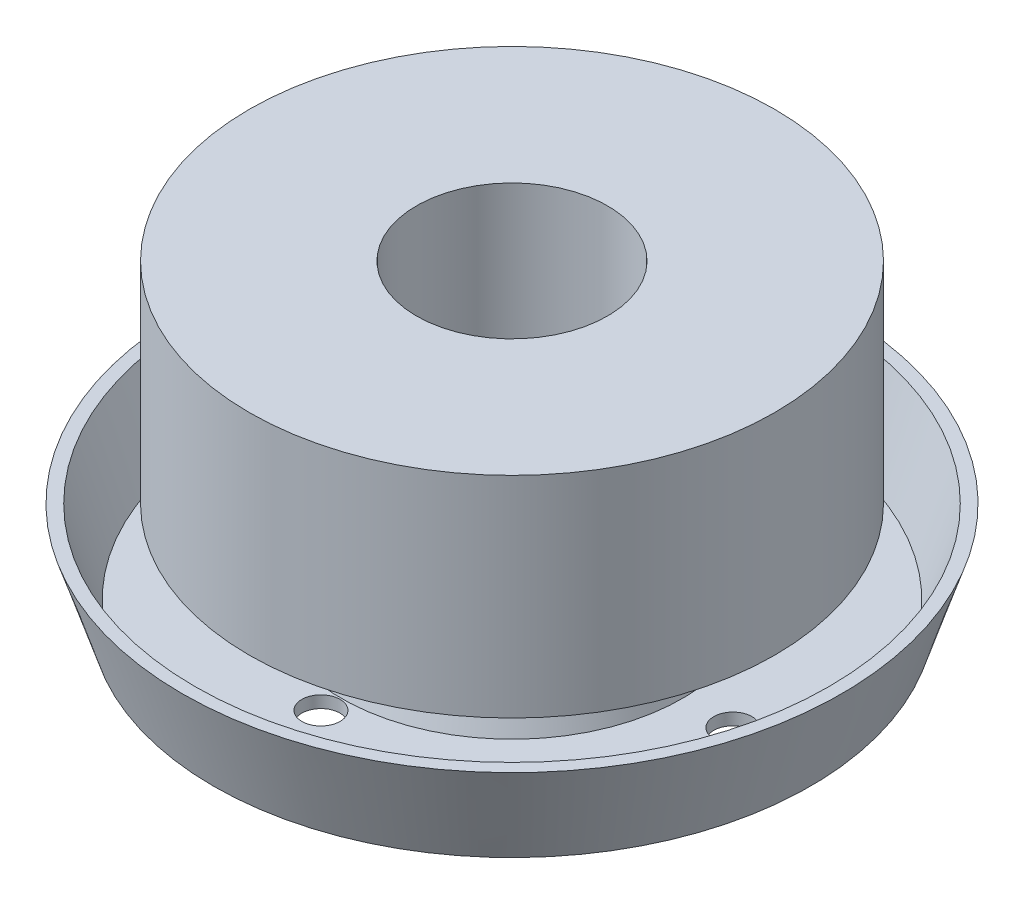
ISO-10303-21;
HEADER;
FILE_DESCRIPTION(('STEP AP214'),'2;1');
FILE_NAME('part.step','',(''),(''),'','','');
FILE_SCHEMA(('AUTOMOTIVE_DESIGN { 1 0 10303 214 1 1 1 1 }'));
ENDSEC;
DATA;
#1=APPLICATION_CONTEXT('core data for automotive mechanical design processes');
#2=APPLICATION_PROTOCOL_DEFINITION('international standard','automotive_design',2000,#1);
#3=PRODUCT_CONTEXT('',#1,'mechanical');
#4=PRODUCT('Part','Part','',(#3));
#5=PRODUCT_RELATED_PRODUCT_CATEGORY('part','',(#4));
#6=PRODUCT_DEFINITION_FORMATION('','',#4);
#7=PRODUCT_DEFINITION_CONTEXT('part definition',#1,'design');
#8=PRODUCT_DEFINITION('design','',#6,#7);
#9=PRODUCT_DEFINITION_SHAPE('','',#8);
#10=(LENGTH_UNIT() NAMED_UNIT(*) SI_UNIT(.MILLI.,.METRE.));
#11=(NAMED_UNIT(*) PLANE_ANGLE_UNIT() SI_UNIT($,.RADIAN.));
#12=(NAMED_UNIT(*) SI_UNIT($,.STERADIAN.) SOLID_ANGLE_UNIT());
#13=UNCERTAINTY_MEASURE_WITH_UNIT(LENGTH_MEASURE(1.E-05),#10,'distance_accuracy_value','');
#14=(GEOMETRIC_REPRESENTATION_CONTEXT(3) GLOBAL_UNCERTAINTY_ASSIGNED_CONTEXT((#13)) GLOBAL_UNIT_ASSIGNED_CONTEXT((#10,
#11,#12)) REPRESENTATION_CONTEXT('',''));
#15=CARTESIAN_POINT('',(0.,0.,0.));
#16=DIRECTION('',(0.,0.,1.));
#17=DIRECTION('',(1.,0.,0.));
#18=AXIS2_PLACEMENT_3D('',#15,#16,#17);
#19=CARTESIAN_POINT('',(1.5,4.,0.));
#20=DIRECTION('',(0.,1.,0.));
#21=DIRECTION('',(0.,0.,1.));
#22=AXIS2_PLACEMENT_3D('',#19,#20,#21);
#23=PLANE('',#22);
#24=CARTESIAN_POINT('',(0.,4.,0.));
#25=DIRECTION('',(0.,1.,0.));
#26=DIRECTION('',(0.,0.,1.));
#27=AXIS2_PLACEMENT_3D('',#24,#25,#26);
#28=CIRCLE('',#27,4.);
#29=CARTESIAN_POINT('',(0.,4.,4.));
#30=VERTEX_POINT('',#29);
#31=EDGE_CURVE('E11',#30,#30,#28,.F.);
#32=ORIENTED_EDGE('',*,*,#31,.F.);
#33=EDGE_LOOP('',(#32));
#34=FACE_BOUND('',#33,.T.);
#35=CARTESIAN_POINT('',(0.,4.,0.));
#36=DIRECTION('',(0.,-1.,0.));
#37=DIRECTION('',(0.,0.,-1.));
#38=AXIS2_PLACEMENT_3D('',#35,#36,#37);
#39=CIRCLE('',#38,1.5);
#40=CARTESIAN_POINT('',(0.,4.,-1.5));
#41=VERTEX_POINT('',#40);
#42=EDGE_CURVE('E138',#41,#41,#39,.T.);
#43=ORIENTED_EDGE('',*,*,#42,.T.);
#44=EDGE_LOOP('',(#43));
#45=FACE_BOUND('',#44,.T.);
#46=ADVANCED_FACE('F33',(#34,#45),#23,.T.);
#47=CARTESIAN_POINT('',(0.,0.5,0.));
#48=DIRECTION('',(0.,-1.,0.));
#49=DIRECTION('',(0.,0.,-1.));
#50=AXIS2_PLACEMENT_3D('',#47,#48,#49);
#51=CONICAL_SURFACE('',#50,7.1375,0.314231899084339);
#52=CARTESIAN_POINT('',(0.,4.,0.));
#53=DIRECTION('',(0.,1.,0.));
#54=DIRECTION('',(0.,0.,1.));
#55=AXIS2_PLACEMENT_3D('',#52,#53,#54);
#56=CIRCLE('',#55,6.);
#57=CARTESIAN_POINT('',(0.,4.,6.));
#58=VERTEX_POINT('',#57);
#59=EDGE_CURVE('E141',#58,#58,#56,.F.);
#60=ORIENTED_EDGE('',*,*,#59,.T.);
#61=EDGE_LOOP('',(#60));
#62=FACE_BOUND('',#61,.T.);
#63=CARTESIAN_POINT('',(0.,0.5,0.));
#64=DIRECTION('',(0.,-1.,0.));
#65=DIRECTION('',(0.,0.,-1.));
#66=AXIS2_PLACEMENT_3D('',#63,#64,#65);
#67=CIRCLE('',#66,7.1375);
#68=CARTESIAN_POINT('',(0.,0.5,-7.1375));
#69=VERTEX_POINT('',#68);
#70=EDGE_CURVE('E40',#69,#69,#67,.T.);
#71=ORIENTED_EDGE('',*,*,#70,.F.);
#72=EDGE_LOOP('',(#71));
#73=FACE_BOUND('',#72,.T.);
#74=ADVANCED_FACE('F127',(#62,#73),#51,.T.);
#75=CARTESIAN_POINT('',(7.1375,0.500000000000001,0.));
#76=DIRECTION('',(0.,1.,0.));
#77=DIRECTION('',(0.,0.,1.));
#78=AXIS2_PLACEMENT_3D('',#75,#76,#77);
#79=PLANE('',#78);
#80=CARTESIAN_POINT('',(0.,0.500000000000001,-8.));
#81=DIRECTION('',(0.,1.,0.));
#82=DIRECTION('',(0.,0.,1.));
#83=AXIS2_PLACEMENT_3D('',#80,#81,#82);
#84=CIRCLE('',#83,0.8);
#85=CARTESIAN_POINT('',(0.,0.500000000000001,-7.2));
#86=VERTEX_POINT('',#85);
#87=EDGE_CURVE('E245',#86,#86,#84,.T.);
#88=ORIENTED_EDGE('',*,*,#87,.F.);
#89=EDGE_LOOP('',(#88));
#90=FACE_BOUND('',#89,.T.);
#91=CARTESIAN_POINT('',(0.,0.500000000000001,8.));
#92=DIRECTION('',(0.,1.,0.));
#93=DIRECTION('',(0.,0.,1.));
#94=AXIS2_PLACEMENT_3D('',#91,#92,#93);
#95=CIRCLE('',#94,0.8);
#96=CARTESIAN_POINT('',(0.,0.500000000000001,8.8));
#97=VERTEX_POINT('',#96);
#98=EDGE_CURVE('E256',#97,#97,#95,.T.);
#99=ORIENTED_EDGE('',*,*,#98,.F.);
#100=EDGE_LOOP('',(#99));
#101=FACE_BOUND('',#100,.T.);
#102=CARTESIAN_POINT('',(9.25,0.500000000000001,0.));
#103=DIRECTION('',(0.,1.,0.));
#104=DIRECTION('',(0.,0.,1.));
#105=AXIS2_PLACEMENT_3D('',#102,#103,#104);
#106=CIRCLE('',#105,0.8);
#107=CARTESIAN_POINT('',(9.25,0.500000000000001,0.8));
#108=VERTEX_POINT('',#107);
#109=EDGE_CURVE('E262',#108,#108,#106,.T.);
#110=ORIENTED_EDGE('',*,*,#109,.F.);
#111=EDGE_LOOP('',(#110));
#112=FACE_BOUND('',#111,.T.);
#113=CARTESIAN_POINT('',(-9.25,0.500000000000001,0.));
#114=DIRECTION('',(0.,1.,0.));
#115=DIRECTION('',(0.,0.,1.));
#116=AXIS2_PLACEMENT_3D('',#113,#114,#115);
#117=CIRCLE('',#116,0.8);
#118=CARTESIAN_POINT('',(-9.25,0.500000000000001,0.8));
#119=VERTEX_POINT('',#118);
#120=EDGE_CURVE('E268',#119,#119,#117,.T.);
#121=ORIENTED_EDGE('',*,*,#120,.F.);
#122=EDGE_LOOP('',(#121));
#123=FACE_BOUND('',#122,.T.);
#124=ORIENTED_EDGE('',*,*,#70,.T.);
#125=EDGE_LOOP('',(#124));
#126=FACE_BOUND('',#125,.T.);
#127=CARTESIAN_POINT('',(0.,0.500000000000002,0.));
#128=DIRECTION('',(0.,-1.,0.));
#129=DIRECTION('',(0.,0.,-1.));
#130=AXIS2_PLACEMENT_3D('',#127,#128,#129);
#131=CIRCLE('',#130,12.1367564788797);
#132=CARTESIAN_POINT('',(0.,0.500000000000002,-12.1367564788797));
#133=VERTEX_POINT('',#132);
#134=EDGE_CURVE('E159',#133,#133,#131,.T.);
#135=ORIENTED_EDGE('',*,*,#134,.F.);
#136=EDGE_LOOP('',(#135));
#137=FACE_BOUND('',#136,.T.);
#138=ADVANCED_FACE('F132',(#90,#101,#112,#123,#126,#137),#79,.T.);
#139=CARTESIAN_POINT('',(0.,4.,0.));
#140=DIRECTION('',(0.,1.,0.));
#141=DIRECTION('',(0.,0.,1.));
#142=AXIS2_PLACEMENT_3D('',#139,#140,#141);
#143=CONICAL_SURFACE('',#142,13.2742564788797,0.314231899084338);
#144=ORIENTED_EDGE('',*,*,#134,.T.);
#145=EDGE_LOOP('',(#144));
#146=FACE_BOUND('',#145,.T.);
#147=CARTESIAN_POINT('',(0.,4.,0.));
#148=DIRECTION('',(0.,-1.,0.));
#149=DIRECTION('',(0.,0.,-1.));
#150=AXIS2_PLACEMENT_3D('',#147,#148,#149);
#151=CIRCLE('',#150,13.2742564788797);
#152=CARTESIAN_POINT('',(0.,4.,-13.2742564788797));
#153=VERTEX_POINT('',#152);
#154=EDGE_CURVE('E156',#153,#153,#151,.T.);
#155=ORIENTED_EDGE('',*,*,#154,.F.);
#156=EDGE_LOOP('',(#155));
#157=FACE_BOUND('',#156,.T.);
#158=ADVANCED_FACE('F167',(#146,#157),#143,.F.);
#159=CARTESIAN_POINT('',(13.2742564788797,4.,0.));
#160=DIRECTION('',(0.,1.,0.));
#161=DIRECTION('',(0.,0.,1.));
#162=AXIS2_PLACEMENT_3D('',#159,#160,#161);
#163=PLANE('',#162);
#164=ORIENTED_EDGE('',*,*,#154,.T.);
#165=EDGE_LOOP('',(#164));
#166=FACE_BOUND('',#165,.T.);
#167=CARTESIAN_POINT('',(0.,4.,0.));
#168=DIRECTION('',(0.,-1.,0.));
#169=DIRECTION('',(0.,0.,-1.));
#170=AXIS2_PLACEMENT_3D('',#167,#168,#169);
#171=CIRCLE('',#170,13.8);
#172=CARTESIAN_POINT('',(0.,4.,-13.8));
#173=VERTEX_POINT('',#172);
#174=EDGE_CURVE('E153',#173,#173,#171,.T.);
#175=ORIENTED_EDGE('',*,*,#174,.F.);
#176=EDGE_LOOP('',(#175));
#177=FACE_BOUND('',#176,.T.);
#178=ADVANCED_FACE('F174',(#166,#177),#163,.T.);
#179=CARTESIAN_POINT('',(0.,0.,0.));
#180=DIRECTION('',(0.,1.,0.));
#181=DIRECTION('',(0.,0.,1.));
#182=AXIS2_PLACEMENT_3D('',#179,#180,#181);
#183=CONICAL_SURFACE('',#182,12.5,0.314231899084338);
#184=CARTESIAN_POINT('',(0.,2.025,0.));
#185=DIRECTION('',(0.,-1.,0.));
#186=DIRECTION('',(0.,0.,-1.));
#187=AXIS2_PLACEMENT_3D('',#184,#185,#186);
#188=CIRCLE('',#187,13.158125);
#189=CARTESIAN_POINT('',(-10.146004008977,2.025,-8.37823705593532));
#190=VERTEX_POINT('',#189);
#191=CARTESIAN_POINT('',(-8.37823705599946,2.025,-10.146004008924));
#192=VERTEX_POINT('',#191);
#193=EDGE_CURVE('E51',#190,#192,#188,.T.);
#194=ORIENTED_EDGE('',*,*,#193,.T.);
#195=CARTESIAN_POINT('',(-9.10446725478505,2.81115090230182,-9.8505830274228));
#196=CARTESIAN_POINT('',(-9.10046586438459,2.78731047784335,-9.84372996029752));
#197=CARTESIAN_POINT('',(-9.09558285151649,2.76340900573963,-9.83766570863274));
#198=CARTESIAN_POINT('',(-9.08409675170892,2.71566237134349,-9.82715174473915));
#199=CARTESIAN_POINT('',(-9.07749353975123,2.69181721327094,-9.82270214991436));
#200=CARTESIAN_POINT('',(-9.05520436848739,2.62075045297611,-9.81184905533809));
#201=CARTESIAN_POINT('',(-9.03701966384732,2.57388396729258,-9.80790874423187));
#202=CARTESIAN_POINT('',(-8.99714438765298,2.48840114687558,-9.80682776621521));
#203=CARTESIAN_POINT('',(-8.97613495058495,2.44946912831496,-9.80892894618525));
#204=CARTESIAN_POINT('',(-8.92990993842776,2.37486206605083,-9.81827851489074));
#205=CARTESIAN_POINT('',(-8.90469660238664,2.3391853041258,-9.82552417027393));
#206=CARTESIAN_POINT('',(-8.85061434950575,2.272133243833,-9.84498412846891));
#207=CARTESIAN_POINT('',(-8.82174023922444,2.24076419104403,-9.85720554582116));
#208=CARTESIAN_POINT('',(-8.76107976529369,2.18342845002572,-9.88627489676121));
#209=CARTESIAN_POINT('',(-8.72929310021118,2.15746232188043,-9.90312330957827));
#210=CARTESIAN_POINT('',(-8.66454445206951,2.11249246061369,-9.94043964605623));
#211=CARTESIAN_POINT('',(-8.63163599979689,2.09332233636348,-9.96079972201094));
#212=CARTESIAN_POINT('',(-8.56479878669266,2.06174095443801,-10.0048201608344));
#213=CARTESIAN_POINT('',(-8.53087031547977,2.04932779699826,-10.0284795937153));
#214=CARTESIAN_POINT('',(-8.4643517045042,2.03213894887777,-10.0773853776983));
#215=CARTESIAN_POINT('',(-8.43176140512691,2.0270821042305,-10.1025327313637));
#216=CARTESIAN_POINT('',(-8.36755928253459,2.02396354556576,-10.1544592723805));
#217=CARTESIAN_POINT('',(-8.33594726215655,2.02590041264818,-10.1812381276454));
#218=CARTESIAN_POINT('',(-8.27575090435914,2.03660122012645,-10.2346959403403));
#219=CARTESIAN_POINT('',(-8.24710010839934,2.04513031782457,-10.2613472183101));
#220=CARTESIAN_POINT('',(-8.19253241502463,2.06851183702559,-10.3146718143019));
#221=CARTESIAN_POINT('',(-8.16661510955956,2.08336331306438,-10.3413451284334));
#222=CARTESIAN_POINT('',(-8.11878242850482,2.11859705536543,-10.3934721629957));
#223=CARTESIAN_POINT('',(-8.09680050803118,2.13886914911004,-10.4189394173286));
#224=CARTESIAN_POINT('',(-8.05689409631081,2.184432349774,-10.4685216559352));
#225=CARTESIAN_POINT('',(-8.03896951619464,2.20972334673966,-10.4926366698188));
#226=CARTESIAN_POINT('',(-8.00760701432579,2.26465101202723,-10.5390199517032));
#227=CARTESIAN_POINT('',(-7.99418799795924,2.29430525883202,-10.5612801505225));
#228=CARTESIAN_POINT('',(-7.97225930979306,2.35697846354947,-10.603337932801));
#229=CARTESIAN_POINT('',(-7.96375019587627,2.38999780331618,-10.6231352362156));
#230=CARTESIAN_POINT('',(-7.95160270612084,2.45949547212094,-10.6604230417189));
#231=CARTESIAN_POINT('',(-7.94812058263219,2.49604852485268,-10.6778249138521));
#232=CARTESIAN_POINT('',(-7.94649748638157,2.57068756752607,-10.7092544417593));
#233=CARTESIAN_POINT('',(-7.94835770327318,2.60877389704186,-10.7232813452281));
#234=CARTESIAN_POINT('',(-7.9574741406451,2.68742792833634,-10.7483405864298));
#235=CARTESIAN_POINT('',(-7.96499736503464,2.72802400563657,-10.7591865616243));
#236=CARTESIAN_POINT('',(-7.98541909642572,2.80876002174867,-10.776713530093));
#237=CARTESIAN_POINT('',(-7.99831906038778,2.84889983389335,-10.7833933932304));
#238=CARTESIAN_POINT('',(-8.02986470165306,2.92978266103015,-10.7927061106945));
#239=CARTESIAN_POINT('',(-8.04877282457224,2.97044967484185,-10.795112017111));
#240=CARTESIAN_POINT('',(-8.0914817773756,3.04913448908793,-10.7951123329713));
#241=CARTESIAN_POINT('',(-8.11528369013789,3.08715170068746,-10.7927056764804));
#242=CARTESIAN_POINT('',(-8.167788832135,3.16046075692693,-10.7829305097148));
#243=CARTESIAN_POINT('',(-8.19660303257407,3.19565652033925,-10.7754351101846));
#244=CARTESIAN_POINT('',(-8.25786252279107,3.26111911770354,-10.7553955414156));
#245=CARTESIAN_POINT('',(-8.29030771057043,3.29138609005227,-10.7428515139726));
#246=CARTESIAN_POINT('',(-8.3571506033155,3.34535419025132,-10.7131862057612));
#247=CARTESIAN_POINT('',(-8.39149184972092,3.3691816757684,-10.6961683412704));
#248=CARTESIAN_POINT('',(-8.46167785629314,3.41015116587065,-10.657737303471));
#249=CARTESIAN_POINT('',(-8.49752198930268,3.42729592901176,-10.6363259493309));
#250=CARTESIAN_POINT('',(-8.56722518559277,3.45323109494018,-10.591095873156));
#251=CARTESIAN_POINT('',(-8.60106704198057,3.46247977712044,-10.5675137988221));
#252=CARTESIAN_POINT('',(-8.66788822445103,3.47388082950814,-10.5175754799276));
#253=CARTESIAN_POINT('',(-8.7008679470424,3.47603652095382,-10.4912205397077));
#254=CARTESIAN_POINT('',(-8.76268434028099,3.47313396193936,-10.4384020824635));
#255=CARTESIAN_POINT('',(-8.79165060191869,3.46854802152978,-10.4120634403238));
#256=CARTESIAN_POINT('',(-8.84696174482539,3.45309239624822,-10.3585025269338));
#257=CARTESIAN_POINT('',(-8.873307508361,3.44222483471662,-10.3312805572029));
#258=CARTESIAN_POINT('',(-8.92078952252315,3.41559014814223,-10.2788411177094));
#259=CARTESIAN_POINT('',(-8.94216750755933,3.40024760510442,-10.2536251647237));
#260=CARTESIAN_POINT('',(-8.98157924601916,3.36493128017833,-10.2038347641076));
#261=CARTESIAN_POINT('',(-8.99961261438279,3.34495696563706,-10.1792603906206));
#262=CARTESIAN_POINT('',(-9.03440219512856,3.29768333958338,-10.1278295174798));
#263=CARTESIAN_POINT('',(-9.0505766457204,3.26973793134253,-10.1011718359061));
#264=CARTESIAN_POINT('',(-9.07780439589033,3.20943700032507,-10.0503169455468));
#265=CARTESIAN_POINT('',(-9.08885493124983,3.17707910928099,-10.0261210703224));
#266=CARTESIAN_POINT('',(-9.10291933317099,3.12033055640758,-9.98840154732479));
#267=CARTESIAN_POINT('',(-9.10738331881578,3.09686098967865,-9.97400152620666));
#268=CARTESIAN_POINT('',(-9.11397941340273,3.04879505350797,-9.94679692404559));
#269=CARTESIAN_POINT('',(-9.11611851429827,3.02420229577863,-9.93398766239114));
#270=CARTESIAN_POINT('',(-9.11711129285038,2.99915479460694,-9.92202115531403));
#271=B_SPLINE_CURVE_WITH_KNOTS('',3,(#195,#196,#197,#198,#199,#200,#201,#202,#203,#204,#205,
#206,#207,#208,#209,#210,#211,#212,#213,#214,#215,#216,#217,#218,#219,#220,#221,#222,#223,#224,
#225,#226,#227,#228,#229,#230,#231,#232,#233,#234,#235,#236,#237,#238,#239,#240,#241,#242,#243,
#244,#245,#246,#247,#248,#249,#250,#251,#252,#253,#254,#255,#256,#257,#258,#259,#260,#261,#262,
#263,#264,#265,#266,#267,#268,#269,#270),.UNSPECIFIED.,.F.,.F.,(4,2,2,2,2,2,2,2,2,2,2,2,2,2,2,2,
2,2,2,2,2,2,2,2,2,2,2,2,2,2,2,2,2,2,2,2,2,4),(0.,0.0753184512547778,0.150642377925966,
0.300936681191668,0.433222974170564,0.565439033610376,0.69784480844737,0.830264302049995,
0.959171777923112,1.08804299188932,1.21184621026121,1.33562431256651,1.45518536495922,
1.57472854417369,1.69200577512748,1.80928043706564,1.92704120815863,2.0448153570701,
2.16617679321187,2.28756525669557,2.41506635191868,2.54260201920053,2.67672759280225,
2.8108828771731,2.94851255187219,3.08613836136685,3.22082655783001,3.355459097425,
3.48160973799948,3.60770130109682,3.72536925698429,3.8429974614881,3.95187595767491,
4.06076698108661,4.18573663583405,4.31077363023626,4.39430205160439,4.47757856506719),.UNSPECIFIED.);
#272=CARTESIAN_POINT('',(-8.71292231741254,3.475,-10.4806892703371));
#273=VERTEX_POINT('',#272);
#274=EDGE_CURVE('E77',#192,#273,#271,.T.);
#275=ORIENTED_EDGE('',*,*,#274,.T.);
#276=CARTESIAN_POINT('',(0.,3.475,0.));
#277=DIRECTION('',(0.,1.,0.));
#278=DIRECTION('',(0.,0.,1.));
#279=AXIS2_PLACEMENT_3D('',#276,#277,#278);
#280=CIRCLE('',#279,13.629375);
#281=CARTESIAN_POINT('',(-10.4806892703736,3.475,-8.71292231736865));
#282=VERTEX_POINT('',#281);
#283=EDGE_CURVE('E98',#273,#282,#280,.T.);
#284=ORIENTED_EDGE('',*,*,#283,.T.);
#285=CARTESIAN_POINT('',(-10.1553129683004,3.32294525516756,-9.01581146015517));
#286=CARTESIAN_POINT('',(-10.1806942042248,3.3463125432444,-8.99866644397952));
#287=CARTESIAN_POINT('',(-10.2068052746998,3.36734574825155,-8.97940029560334));
#288=CARTESIAN_POINT('',(-10.2596897011049,3.40418615269,-8.93716377202811));
#289=CARTESIAN_POINT('',(-10.286462849167,3.41999497054774,-8.91419454726603));
#290=CARTESIAN_POINT('',(-10.3399264621646,3.44586120679155,-8.8650458012861));
#291=CARTESIAN_POINT('',(-10.3666167688111,3.45591091169564,-8.83886203135156));
#292=CARTESIAN_POINT('',(-10.4190489168896,3.46992655035761,-8.78406334610791));
#293=CARTESIAN_POINT('',(-10.4447912637687,3.47389577341361,-8.75544975408424));
#294=CARTESIAN_POINT('',(-10.4942853298422,3.47569221941609,-8.69697767504745));
#295=CARTESIAN_POINT('',(-10.518057605054,3.47359423648877,-8.66713878021414));
#296=CARTESIAN_POINT('',(-10.5633533888234,3.46359253504437,-8.60673027762977));
#297=CARTESIAN_POINT('',(-10.5848760822729,3.45568672040443,-8.57616040991575));
#298=CARTESIAN_POINT('',(-10.6257154548483,3.43414674044475,-8.51432230716185));
#299=CARTESIAN_POINT('',(-10.6449596018042,3.42036798208283,-8.48305674859201));
#300=CARTESIAN_POINT('',(-10.680204154134,3.38760012257219,-8.42145227629911));
#301=CARTESIAN_POINT('',(-10.6962040762342,3.36861024614289,-8.3911135012046));
#302=CARTESIAN_POINT('',(-10.7256000522357,3.32471955883638,-8.330279720444));
#303=CARTESIAN_POINT('',(-10.738777137516,3.29952837188901,-8.29988854011376));
#304=CARTESIAN_POINT('',(-10.7610616576069,3.24472245794303,-8.24171454933821));
#305=CARTESIAN_POINT('',(-10.7701676563175,3.21510617487304,-8.21393266206208));
#306=CARTESIAN_POINT('',(-10.7846994565309,3.15016912062849,-8.15991874010875));
#307=CARTESIAN_POINT('',(-10.7898452201618,3.11460179747732,-8.13390732464326));
#308=CARTESIAN_POINT('',(-10.7954228802454,3.04029034208264,-8.086282507763));
#309=CARTESIAN_POINT('',(-10.795853631892,3.00154544062299,-8.06467017569665));
#310=CARTESIAN_POINT('',(-10.791970932934,2.92040718260993,-8.02575491004735));
#311=CARTESIAN_POINT('',(-10.7874831517514,2.87793217405327,-8.0086387942775));
#312=CARTESIAN_POINT('',(-10.7735869288577,2.79180625440226,-7.98038621367449));
#313=CARTESIAN_POINT('',(-10.7641784171707,2.74815532659395,-7.96924983388154));
#314=CARTESIAN_POINT('',(-10.7407471674501,2.66141870876908,-7.95352347764444));
#315=CARTESIAN_POINT('',(-10.7267749062728,2.61833197040732,-7.94886469372671));
#316=CARTESIAN_POINT('',(-10.6944697424558,2.53360575086563,-7.94619155821638));
#317=CARTESIAN_POINT('',(-10.6761380675909,2.49196586597497,-7.94817533788222));
#318=CARTESIAN_POINT('',(-10.6365127755848,2.41349970192589,-7.95862972547996));
#319=CARTESIAN_POINT('',(-10.6154036938459,2.3765382862405,-7.96678421687027));
#320=CARTESIAN_POINT('',(-10.5701234032986,2.30649260895235,-7.98906524765772));
#321=CARTESIAN_POINT('',(-10.5459532770314,2.27340698459665,-8.00318967988758));
#322=CARTESIAN_POINT('',(-10.4965969959026,2.21398903498484,-8.03608111024167));
#323=CARTESIAN_POINT('',(-10.4715386231961,2.18738639691802,-8.05455209085192));
#324=CARTESIAN_POINT('',(-10.4199368992535,2.13961781231367,-8.0959179370339));
#325=CARTESIAN_POINT('',(-10.3933938871096,2.11845063044103,-8.11881179532641));
#326=CARTESIAN_POINT('',(-10.3405050621966,2.08288987961931,-8.16742883445582));
#327=CARTESIAN_POINT('',(-10.314184277565,2.06828704153377,-8.19302651132073));
#328=CARTESIAN_POINT('',(-10.2615683370254,2.04523835269468,-8.2468786664678));
#329=CARTESIAN_POINT('',(-10.2352731795064,2.03679208613864,-8.2751329651815));
#330=CARTESIAN_POINT('',(-10.1835949592533,2.02629997550043,-8.33326259973648));
#331=CARTESIAN_POINT('',(-10.1582071523647,2.02421369159952,-8.36312645936859));
#332=CARTESIAN_POINT('',(-10.1088497022392,2.02631539335356,-8.42378721885474));
#333=CARTESIAN_POINT('',(-10.0848801469952,2.03050376788529,-8.45458417642235));
#334=CARTESIAN_POINT('',(-10.0386031109935,2.04507063035787,-8.5168026149353));
#335=CARTESIAN_POINT('',(-10.0163307168011,2.05555290554555,-8.54822582877789));
#336=CARTESIAN_POINT('',(-9.97449949558994,2.08239133572995,-8.61035436079341));
#337=CARTESIAN_POINT('',(-9.95494083656501,2.09874785414695,-8.64105963442452));
#338=CARTESIAN_POINT('',(-9.91847127017555,2.13738789701667,-8.70195402547489));
#339=CARTESIAN_POINT('',(-9.90166304239657,2.15984172618605,-8.73209649980857));
#340=CARTESIAN_POINT('',(-9.8718982592474,2.20970283596975,-8.79011974784283));
#341=CARTESIAN_POINT('',(-9.85894380764432,2.23711280905309,-8.81799928019284));
#342=CARTESIAN_POINT('',(-9.83679800021356,2.29720296023839,-8.87188593979708));
#343=CARTESIAN_POINT('',(-9.82777136354442,2.33004583575562,-8.89777911588355));
#344=CARTESIAN_POINT('',(-9.8144761617733,2.39917467368736,-8.94582769937025));
#345=CARTESIAN_POINT('',(-9.81020049699129,2.4354554103886,-8.9679886419209));
#346=CARTESIAN_POINT('',(-9.80743047419845,2.49116995950869,-8.99781192221613));
#347=CARTESIAN_POINT('',(-9.80709445563706,2.50968254651486,-9.00707360604068));
#348=CARTESIAN_POINT('',(-9.80733381153371,2.52841877587277,-9.01581146013518));
#349=B_SPLINE_CURVE_WITH_KNOTS('',3,(#285,#286,#287,#288,#289,#290,#291,#292,#293,#294,#295,
#296,#297,#298,#299,#300,#301,#302,#303,#304,#305,#306,#307,#308,#309,#310,#311,#312,#313,#314,
#315,#316,#317,#318,#319,#320,#321,#322,#323,#324,#325,#326,#327,#328,#329,#330,#331,#332,#333,
#334,#335,#336,#337,#338,#339,#340,#341,#342,#343,#344,#345,#346,#347,#348),.UNSPECIFIED.,.F.,
.F.,(4,2,2,2,2,2,2,2,2,2,2,2,2,2,2,2,2,2,2,2,2,2,2,2,2,2,2,2,2,2,2,4),(0.,0.115460983714319,
0.230886165974023,0.346465584073086,0.46198245621114,0.576081375178658,0.690221494190537,
0.807350733795918,0.924497408680922,1.0488053733162,1.17315715379106,1.30565188190332,
1.43817877905007,1.57555937291167,1.71294192046564,1.84885369154661,1.9847272300039,
2.11407521339796,2.24337757983623,2.36561112785402,2.48781687078992,2.60578870877162,
2.72375257843339,2.8409647960905,2.95818427836581,3.07739195179665,3.19660700148813,
3.31957327883099,3.44260656050424,3.5703931121462,3.69798844630695,3.76002899771061),.UNSPECIFIED.);
#350=EDGE_CURVE('E47',#282,#190,#349,.T.);
#351=ORIENTED_EDGE('',*,*,#350,.T.);
#352=EDGE_LOOP('',(#194,#275,#284,#351));
#353=FACE_BOUND('',#352,.T.);
#354=ORIENTED_EDGE('',*,*,#174,.T.);
#355=EDGE_LOOP('',(#354));
#356=FACE_BOUND('',#355,.T.);
#357=CARTESIAN_POINT('',(0.,0.,0.));
#358=DIRECTION('',(0.,-1.,0.));
#359=DIRECTION('',(0.,0.,-1.));
#360=AXIS2_PLACEMENT_3D('',#357,#358,#359);
#361=CIRCLE('',#360,12.5);
#362=CARTESIAN_POINT('',(0.,0.,-12.5));
#363=VERTEX_POINT('',#362);
#364=EDGE_CURVE('E144',#363,#363,#361,.T.);
#365=ORIENTED_EDGE('',*,*,#364,.F.);
#366=EDGE_LOOP('',(#365));
#367=FACE_BOUND('',#366,.T.);
#368=ADVANCED_FACE('F180',(#353,#356,#367),#183,.T.);
#369=CARTESIAN_POINT('',(1.5,0.,0.));
#370=DIRECTION('',(0.,-1.,0.));
#371=DIRECTION('',(0.,0.,-1.));
#372=AXIS2_PLACEMENT_3D('',#369,#370,#371);
#373=PLANE('',#372);
#374=CARTESIAN_POINT('',(0.,0.,-8.));
#375=DIRECTION('',(0.,-1.,0.));
#376=DIRECTION('',(0.,0.,-1.));
#377=AXIS2_PLACEMENT_3D('',#374,#375,#376);
#378=CIRCLE('',#377,0.8);
#379=CARTESIAN_POINT('',(0.,0.,-8.8));
#380=VERTEX_POINT('',#379);
#381=EDGE_CURVE('E242',#380,#380,#378,.T.);
#382=ORIENTED_EDGE('',*,*,#381,.F.);
#383=EDGE_LOOP('',(#382));
#384=FACE_BOUND('',#383,.T.);
#385=CARTESIAN_POINT('',(0.,0.,8.));
#386=DIRECTION('',(0.,-1.,0.));
#387=DIRECTION('',(0.,0.,-1.));
#388=AXIS2_PLACEMENT_3D('',#385,#386,#387);
#389=CIRCLE('',#388,0.8);
#390=CARTESIAN_POINT('',(0.,0.,7.2));
#391=VERTEX_POINT('',#390);
#392=EDGE_CURVE('E253',#391,#391,#389,.T.);
#393=ORIENTED_EDGE('',*,*,#392,.F.);
#394=EDGE_LOOP('',(#393));
#395=FACE_BOUND('',#394,.T.);
#396=CARTESIAN_POINT('',(9.25,0.,0.));
#397=DIRECTION('',(0.,-1.,0.));
#398=DIRECTION('',(0.,0.,-1.));
#399=AXIS2_PLACEMENT_3D('',#396,#397,#398);
#400=CIRCLE('',#399,0.8);
#401=CARTESIAN_POINT('',(9.25,0.,-0.8));
#402=VERTEX_POINT('',#401);
#403=EDGE_CURVE('E259',#402,#402,#400,.T.);
#404=ORIENTED_EDGE('',*,*,#403,.F.);
#405=EDGE_LOOP('',(#404));
#406=FACE_BOUND('',#405,.T.);
#407=CARTESIAN_POINT('',(-9.25,0.,0.));
#408=DIRECTION('',(0.,-1.,0.));
#409=DIRECTION('',(0.,0.,-1.));
#410=AXIS2_PLACEMENT_3D('',#407,#408,#409);
#411=CIRCLE('',#410,0.8);
#412=CARTESIAN_POINT('',(-9.25,0.,-0.8));
#413=VERTEX_POINT('',#412);
#414=EDGE_CURVE('E265',#413,#413,#411,.T.);
#415=ORIENTED_EDGE('',*,*,#414,.F.);
#416=EDGE_LOOP('',(#415));
#417=FACE_BOUND('',#416,.T.);
#418=ORIENTED_EDGE('',*,*,#364,.T.);
#419=EDGE_LOOP('',(#418));
#420=FACE_BOUND('',#419,.T.);
#421=CARTESIAN_POINT('',(0.,0.,0.));
#422=DIRECTION('',(0.,-1.,0.));
#423=DIRECTION('',(0.,0.,-1.));
#424=AXIS2_PLACEMENT_3D('',#421,#422,#423);
#425=CIRCLE('',#424,1.5);
#426=CARTESIAN_POINT('',(0.,0.,-1.5));
#427=VERTEX_POINT('',#426);
#428=EDGE_CURVE('E140',#427,#427,#425,.T.);
#429=ORIENTED_EDGE('',*,*,#428,.F.);
#430=EDGE_LOOP('',(#429));
#431=FACE_BOUND('',#430,.T.);
#432=ADVANCED_FACE('F186',(#384,#395,#406,#417,#420,#431),#373,.T.);
#433=CARTESIAN_POINT('',(0.,0.,0.));
#434=DIRECTION('',(0.,-1.,0.));
#435=DIRECTION('',(0.,0.,-1.));
#436=AXIS2_PLACEMENT_3D('',#433,#434,#435);
#437=CYLINDRICAL_SURFACE('',#436,1.5);
#438=ORIENTED_EDGE('',*,*,#428,.T.);
#439=EDGE_LOOP('',(#438));
#440=FACE_BOUND('',#439,.T.);
#441=ORIENTED_EDGE('',*,*,#42,.F.);
#442=EDGE_LOOP('',(#441));
#443=FACE_BOUND('',#442,.T.);
#444=ADVANCED_FACE('F192',(#440,#443),#437,.F.);
#445=CARTESIAN_POINT('',(0.,12.8,0.));
#446=DIRECTION('',(0.,1.,0.));
#447=DIRECTION('',(0.,0.,1.));
#448=AXIS2_PLACEMENT_3D('',#445,#446,#447);
#449=PLANE('',#448);
#450=CARTESIAN_POINT('',(0.,12.8,0.));
#451=DIRECTION('',(0.,1.,0.));
#452=DIRECTION('',(0.,0.,1.));
#453=AXIS2_PLACEMENT_3D('',#450,#451,#452);
#454=CIRCLE('',#453,11.);
#455=CARTESIAN_POINT('',(0.,12.8,11.));
#456=VERTEX_POINT('',#455);
#457=EDGE_CURVE('E147',#456,#456,#454,.T.);
#458=ORIENTED_EDGE('',*,*,#457,.T.);
#459=EDGE_LOOP('',(#458));
#460=FACE_BOUND('',#459,.T.);
#461=CARTESIAN_POINT('',(0.,12.8,0.));
#462=DIRECTION('',(0.,1.,0.));
#463=DIRECTION('',(0.,0.,1.));
#464=AXIS2_PLACEMENT_3D('',#461,#462,#463);
#465=CIRCLE('',#464,4.);
#466=CARTESIAN_POINT('',(0.,12.8,4.));
#467=VERTEX_POINT('',#466);
#468=EDGE_CURVE('E271',#467,#467,#465,.T.);
#469=ORIENTED_EDGE('',*,*,#468,.F.);
#470=EDGE_LOOP('',(#469));
#471=FACE_BOUND('',#470,.T.);
#472=ADVANCED_FACE('F198',(#460,#471),#449,.T.);
#473=CARTESIAN_POINT('',(0.,4.,0.));
#474=DIRECTION('',(0.,1.,0.));
#475=DIRECTION('',(0.,0.,1.));
#476=AXIS2_PLACEMENT_3D('',#473,#474,#475);
#477=PLANE('',#476);
#478=ORIENTED_EDGE('',*,*,#59,.F.);
#479=EDGE_LOOP('',(#478));
#480=FACE_BOUND('',#479,.T.);
#481=CARTESIAN_POINT('',(0.,4.,0.));
#482=DIRECTION('',(0.,1.,0.));
#483=DIRECTION('',(0.,0.,1.));
#484=AXIS2_PLACEMENT_3D('',#481,#482,#483);
#485=CIRCLE('',#484,11.);
#486=CARTESIAN_POINT('',(0.,4.,11.));
#487=VERTEX_POINT('',#486);
#488=EDGE_CURVE('E274',#487,#487,#485,.T.);
#489=ORIENTED_EDGE('',*,*,#488,.F.);
#490=EDGE_LOOP('',(#489));
#491=FACE_BOUND('',#490,.T.);
#492=ADVANCED_FACE('F204',(#480,#491),#477,.F.);
#493=CARTESIAN_POINT('',(0.,12.8,0.));
#494=DIRECTION('',(0.,-1.,0.));
#495=DIRECTION('',(0.,0.,-1.));
#496=AXIS2_PLACEMENT_3D('',#493,#494,#495);
#497=CYLINDRICAL_SURFACE('',#496,11.);
#498=ORIENTED_EDGE('',*,*,#457,.F.);
#499=EDGE_LOOP('',(#498));
#500=FACE_BOUND('',#499,.T.);
#501=ORIENTED_EDGE('',*,*,#488,.T.);
#502=EDGE_LOOP('',(#501));
#503=FACE_BOUND('',#502,.T.);
#504=ADVANCED_FACE('F208',(#500,#503),#497,.T.);
#505=CARTESIAN_POINT('',(0.,12.8,0.));
#506=DIRECTION('',(0.,-1.,0.));
#507=DIRECTION('',(0.,0.,-1.));
#508=AXIS2_PLACEMENT_3D('',#505,#506,#507);
#509=CYLINDRICAL_SURFACE('',#508,4.);
#510=ORIENTED_EDGE('',*,*,#468,.T.);
#511=EDGE_LOOP('',(#510));
#512=FACE_BOUND('',#511,.T.);
#513=ORIENTED_EDGE('',*,*,#31,.T.);
#514=EDGE_LOOP('',(#513));
#515=FACE_BOUND('',#514,.T.);
#516=ADVANCED_FACE('F211',(#512,#515),#509,.F.);
#517=CARTESIAN_POINT('',(-9.25,0.,0.));
#518=DIRECTION('',(0.,-1.,0.));
#519=DIRECTION('',(0.,0.,-1.));
#520=AXIS2_PLACEMENT_3D('',#517,#518,#519);
#521=CYLINDRICAL_SURFACE('',#520,0.8);
#522=ORIENTED_EDGE('',*,*,#414,.T.);
#523=EDGE_LOOP('',(#522));
#524=FACE_BOUND('',#523,.T.);
#525=ORIENTED_EDGE('',*,*,#120,.T.);
#526=EDGE_LOOP('',(#525));
#527=FACE_BOUND('',#526,.T.);
#528=ADVANCED_FACE('F218',(#524,#527),#521,.F.);
#529=CARTESIAN_POINT('',(9.25,0.,0.));
#530=DIRECTION('',(0.,-1.,0.));
#531=DIRECTION('',(0.,0.,-1.));
#532=AXIS2_PLACEMENT_3D('',#529,#530,#531);
#533=CYLINDRICAL_SURFACE('',#532,0.8);
#534=ORIENTED_EDGE('',*,*,#403,.T.);
#535=EDGE_LOOP('',(#534));
#536=FACE_BOUND('',#535,.T.);
#537=ORIENTED_EDGE('',*,*,#109,.T.);
#538=EDGE_LOOP('',(#537));
#539=FACE_BOUND('',#538,.T.);
#540=ADVANCED_FACE('F222',(#536,#539),#533,.F.);
#541=CARTESIAN_POINT('',(0.,0.,8.));
#542=DIRECTION('',(0.,-1.,0.));
#543=DIRECTION('',(0.,0.,-1.));
#544=AXIS2_PLACEMENT_3D('',#541,#542,#543);
#545=CYLINDRICAL_SURFACE('',#544,0.8);
#546=ORIENTED_EDGE('',*,*,#392,.T.);
#547=EDGE_LOOP('',(#546));
#548=FACE_BOUND('',#547,.T.);
#549=ORIENTED_EDGE('',*,*,#98,.T.);
#550=EDGE_LOOP('',(#549));
#551=FACE_BOUND('',#550,.T.);
#552=ADVANCED_FACE('F226',(#548,#551),#545,.F.);
#553=CARTESIAN_POINT('',(0.,0.,-8.));
#554=DIRECTION('',(0.,-1.,0.));
#555=DIRECTION('',(0.,0.,-1.));
#556=AXIS2_PLACEMENT_3D('',#553,#554,#555);
#557=CYLINDRICAL_SURFACE('',#556,0.8);
#558=ORIENTED_EDGE('',*,*,#381,.T.);
#559=EDGE_LOOP('',(#558));
#560=FACE_BOUND('',#559,.T.);
#561=ORIENTED_EDGE('',*,*,#87,.T.);
#562=EDGE_LOOP('',(#561));
#563=FACE_BOUND('',#562,.T.);
#564=ADVANCED_FACE('F118',(#560,#563),#557,.F.);
#565=CARTESIAN_POINT('',(500000.,2.025,499998.232233047));
#566=DIRECTION('',(0.,-1.,0.));
#567=DIRECTION('',(0.,0.,-1.));
#568=AXIS2_PLACEMENT_3D('',#565,#566,#567);
#569=PLANE('',#568);
#570=ORIENTED_EDGE('',*,*,#193,.F.);
#571=DIRECTION('',(-0.707106781186547,0.,-0.707106781186548));
#572=VECTOR('',#571,1.);
#573=CARTESIAN_POINT('',(499998.232233047,2.025,500000.));
#574=LINE('',#573,#572);
#575=CARTESIAN_POINT('',(-14.3189123190276,2.025,-12.5511453660612));
#576=VERTEX_POINT('',#575);
#577=EDGE_CURVE('E79',#190,#576,#574,.T.);
#578=ORIENTED_EDGE('',*,*,#577,.T.);
#579=DIRECTION('',(-0.707106781186548,0.,0.707106781186547));
#580=VECTOR('',#579,1.);
#581=CARTESIAN_POINT('',(-12.5511453660612,2.025,-14.3189123190276));
#582=LINE('',#581,#580);
#583=CARTESIAN_POINT('',(-12.5511453660612,2.025,-14.3189123190276));
#584=VERTEX_POINT('',#583);
#585=EDGE_CURVE('E82',#584,#576,#582,.T.);
#586=ORIENTED_EDGE('',*,*,#585,.F.);
#587=DIRECTION('',(-0.707106781186547,0.,-0.707106781186548));
#588=VECTOR('',#587,1.);
#589=CARTESIAN_POINT('',(500000.,2.025,499998.232233047));
#590=LINE('',#589,#588);
#591=EDGE_CURVE('E71',#192,#584,#590,.T.);
#592=ORIENTED_EDGE('',*,*,#591,.F.);
#593=EDGE_LOOP('',(#570,#578,#586,#592));
#594=FACE_BOUND('',#593,.T.);
#595=ADVANCED_FACE('F83',(#594),#569,.T.);
#596=CARTESIAN_POINT('',(499998.232233047,2.75,500000.));
#597=DIRECTION('',(-0.707106781186547,0.,-0.707106781186548));
#598=DIRECTION('',(-0.707106781186548,0.,0.707106781186547));
#599=AXIS2_PLACEMENT_3D('',#596,#597,#598);
#600=CYLINDRICAL_SURFACE('',#599,0.725);
#601=ORIENTED_EDGE('',*,*,#350,.F.);
#602=DIRECTION('',(-0.707106781186547,0.,-0.707106781186548));
#603=VECTOR('',#602,1.);
#604=CARTESIAN_POINT('',(499998.232233047,3.475,500000.));
#605=LINE('',#604,#603);
#606=CARTESIAN_POINT('',(-14.3189123190276,3.475,-12.5511453660612));
#607=VERTEX_POINT('',#606);
#608=EDGE_CURVE('E241',#282,#607,#605,.T.);
#609=ORIENTED_EDGE('',*,*,#608,.T.);
#610=CARTESIAN_POINT('',(-14.3189123190276,2.75,-12.5511453660612));
#611=DIRECTION('',(-0.707106781186547,0.,-0.707106781186548));
#612=DIRECTION('',(-0.707106781186548,0.,0.707106781186547));
#613=AXIS2_PLACEMENT_3D('',#610,#611,#612);
#614=CIRCLE('',#613,0.725);
#615=EDGE_CURVE('E88',#576,#607,#614,.T.);
#616=ORIENTED_EDGE('',*,*,#615,.F.);
#617=ORIENTED_EDGE('',*,*,#577,.F.);
#618=EDGE_LOOP('',(#601,#609,#616,#617));
#619=FACE_BOUND('',#618,.T.);
#620=ADVANCED_FACE('F117',(#619),#600,.T.);
#621=CARTESIAN_POINT('',(500000.,2.75,499998.232233047));
#622=DIRECTION('',(-0.707106781186547,0.,-0.707106781186548));
#623=DIRECTION('',(-0.707106781186548,0.,0.707106781186547));
#624=AXIS2_PLACEMENT_3D('',#621,#622,#623);
#625=CYLINDRICAL_SURFACE('',#624,0.725);
#626=ORIENTED_EDGE('',*,*,#274,.F.);
#627=ORIENTED_EDGE('',*,*,#591,.T.);
#628=CARTESIAN_POINT('',(-12.5511453660612,2.75,-14.3189123190276));
#629=DIRECTION('',(-0.707106781186547,0.,-0.707106781186548));
#630=DIRECTION('',(-0.707106781186548,0.,0.707106781186547));
#631=AXIS2_PLACEMENT_3D('',#628,#629,#630);
#632=CIRCLE('',#631,0.725);
#633=CARTESIAN_POINT('',(-12.5511453660612,3.475,-14.3189123190276));
#634=VERTEX_POINT('',#633);
#635=EDGE_CURVE('E76',#634,#584,#632,.T.);
#636=ORIENTED_EDGE('',*,*,#635,.F.);
#637=DIRECTION('',(-0.707106781186547,0.,-0.707106781186548));
#638=VECTOR('',#637,1.);
#639=CARTESIAN_POINT('',(500000.,3.475,499998.232233047));
#640=LINE('',#639,#638);
#641=EDGE_CURVE('E240',#273,#634,#640,.T.);
#642=ORIENTED_EDGE('',*,*,#641,.F.);
#643=EDGE_LOOP('',(#626,#627,#636,#642));
#644=FACE_BOUND('',#643,.T.);
#645=ADVANCED_FACE('F73',(#644),#625,.T.);
#646=CARTESIAN_POINT('',(500000.,3.475,499998.232233047));
#647=DIRECTION('',(0.,1.,0.));
#648=DIRECTION('',(0.,0.,1.));
#649=AXIS2_PLACEMENT_3D('',#646,#647,#648);
#650=PLANE('',#649);
#651=ORIENTED_EDGE('',*,*,#283,.F.);
#652=ORIENTED_EDGE('',*,*,#641,.T.);
#653=DIRECTION('',(0.707106781186548,0.,-0.707106781186547));
#654=VECTOR('',#653,1.);
#655=CARTESIAN_POINT('',(-12.5511453660612,3.475,-14.3189123190276));
#656=LINE('',#655,#654);
#657=EDGE_CURVE('E93',#607,#634,#656,.T.);
#658=ORIENTED_EDGE('',*,*,#657,.F.);
#659=ORIENTED_EDGE('',*,*,#608,.F.);
#660=EDGE_LOOP('',(#651,#652,#658,#659));
#661=FACE_BOUND('',#660,.T.);
#662=ADVANCED_FACE('F125',(#661),#650,.T.);
#663=CARTESIAN_POINT('',(-12.5511453660612,2.75,-14.3189123190276));
#664=DIRECTION('',(-0.707106781186547,0.,-0.707106781186548));
#665=DIRECTION('',(-0.707106781186548,0.,0.707106781186547));
#666=AXIS2_PLACEMENT_3D('',#663,#664,#665);
#667=PLANE('',#666);
#668=ORIENTED_EDGE('',*,*,#635,.T.);
#669=ORIENTED_EDGE('',*,*,#585,.T.);
#670=ORIENTED_EDGE('',*,*,#615,.T.);
#671=ORIENTED_EDGE('',*,*,#657,.T.);
#672=EDGE_LOOP('',(#668,#669,#670,#671));
#673=FACE_BOUND('',#672,.T.);
#674=ADVANCED_FACE('F91',(#673),#667,.T.);
#675=CLOSED_SHELL('',(#46,#74,#138,#158,#178,#368,#432,#444,#472,#492,#504,#516,#528,#540,#552,
#564,#595,#620,#645,#662,#674));
#676=MANIFOLD_SOLID_BREP('B2',#675);
#677=ADVANCED_BREP_SHAPE_REPRESENTATION('',(#18,#676),#14);
#678=SHAPE_DEFINITION_REPRESENTATION(#9,#677);
ENDSEC;
END-ISO-10303-21;
